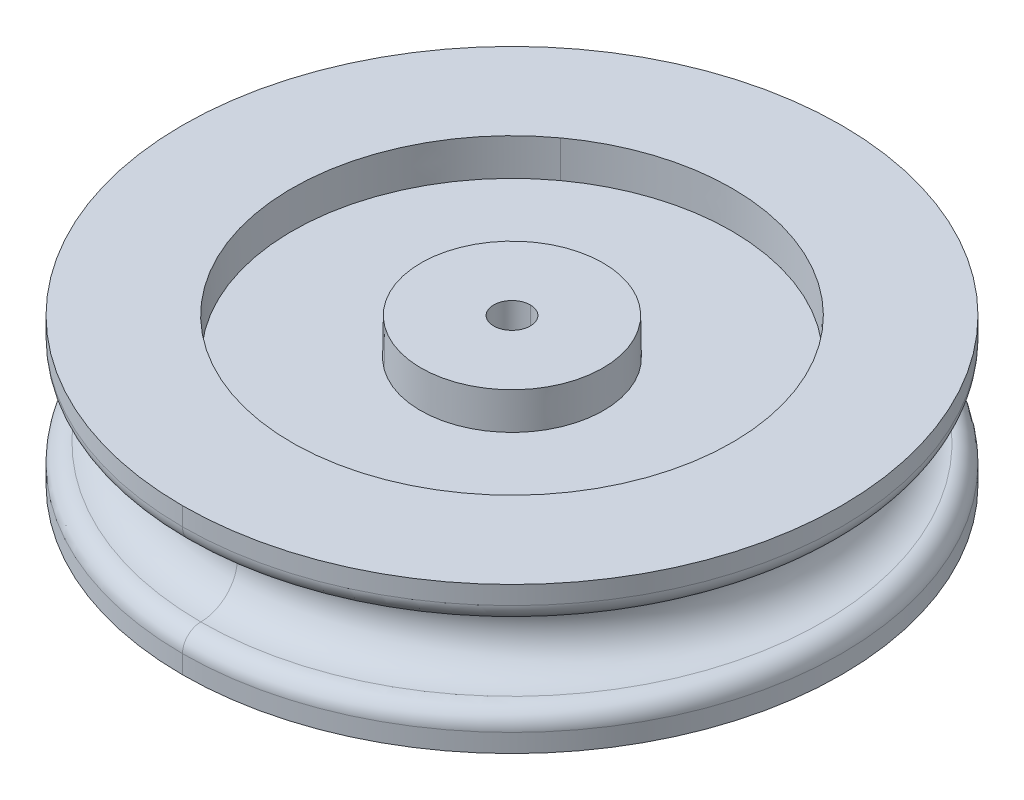
ISO-10303-21;
HEADER;
FILE_DESCRIPTION(('STEP AP214'),'2;1');
FILE_NAME('part.step','',(''),(''),'','','');
FILE_SCHEMA(('AUTOMOTIVE_DESIGN { 1 0 10303 214 1 1 1 1 }'));
ENDSEC;
DATA;
#1=APPLICATION_CONTEXT('core data for automotive mechanical design processes');
#2=APPLICATION_PROTOCOL_DEFINITION('international standard','automotive_design',2000,#1);
#3=PRODUCT_CONTEXT('',#1,'mechanical');
#4=PRODUCT('Part','Part','',(#3));
#5=PRODUCT_RELATED_PRODUCT_CATEGORY('part','',(#4));
#6=PRODUCT_DEFINITION_FORMATION('','',#4);
#7=PRODUCT_DEFINITION_CONTEXT('part definition',#1,'design');
#8=PRODUCT_DEFINITION('design','',#6,#7);
#9=PRODUCT_DEFINITION_SHAPE('','',#8);
#10=(LENGTH_UNIT() NAMED_UNIT(*) SI_UNIT(.MILLI.,.METRE.));
#11=(NAMED_UNIT(*) PLANE_ANGLE_UNIT() SI_UNIT($,.RADIAN.));
#12=(NAMED_UNIT(*) SI_UNIT($,.STERADIAN.) SOLID_ANGLE_UNIT());
#13=UNCERTAINTY_MEASURE_WITH_UNIT(LENGTH_MEASURE(1.E-05),#10,'distance_accuracy_value','');
#14=(GEOMETRIC_REPRESENTATION_CONTEXT(3) GLOBAL_UNCERTAINTY_ASSIGNED_CONTEXT((#13)) GLOBAL_UNIT_ASSIGNED_CONTEXT((#10,
#11,#12)) REPRESENTATION_CONTEXT('',''));
#15=CARTESIAN_POINT('',(0.,0.,0.));
#16=DIRECTION('',(0.,0.,1.));
#17=DIRECTION('',(1.,0.,0.));
#18=AXIS2_PLACEMENT_3D('',#15,#16,#17);
#19=CARTESIAN_POINT('',(0.,3.5,0.));
#20=DIRECTION('',(0.,-1.,0.));
#21=DIRECTION('',(0.,0.,-1.));
#22=AXIS2_PLACEMENT_3D('',#19,#20,#21);
#23=TOROIDAL_SURFACE('',#22,8.50000000000016,0.49999999999996);
#24=CARTESIAN_POINT('',(0.,3.5,-8.50000000000008));
#25=DIRECTION('',(1.,0.,0.));
#26=DIRECTION('',(0.,-1.,1.56125112837913E-13));
#27=AXIS2_PLACEMENT_3D('',#24,#25,#26);
#28=CIRCLE('',#27,0.49999999999996);
#29=CARTESIAN_POINT('',(0.,3.,-8.5));
#30=VERTEX_POINT('',#29);
#31=CARTESIAN_POINT('',(0.,3.5,-9.));
#32=VERTEX_POINT('',#31);
#33=EDGE_CURVE('E339',#30,#32,#28,.T.);
#34=ORIENTED_EDGE('',*,*,#33,.F.);
#35=CARTESIAN_POINT('',(0.,3.,0.));
#36=DIRECTION('',(0.,1.,0.));
#37=DIRECTION('',(0.,0.,-1.));
#38=AXIS2_PLACEMENT_3D('',#35,#36,#37);
#39=CIRCLE('',#38,8.5);
#40=CARTESIAN_POINT('',(0.,3.,8.5));
#41=VERTEX_POINT('',#40);
#42=EDGE_CURVE('E27',#30,#41,#39,.T.);
#43=ORIENTED_EDGE('',*,*,#42,.T.);
#44=CARTESIAN_POINT('',(0.,3.5,8.50000000000008));
#45=DIRECTION('',(-1.,0.,0.));
#46=DIRECTION('',(0.,-1.,-1.56125112837913E-13));
#47=AXIS2_PLACEMENT_3D('',#44,#45,#46);
#48=CIRCLE('',#47,0.49999999999996);
#49=CARTESIAN_POINT('',(0.,3.5,9.));
#50=VERTEX_POINT('',#49);
#51=EDGE_CURVE('E332',#41,#50,#48,.T.);
#52=ORIENTED_EDGE('',*,*,#51,.T.);
#53=CARTESIAN_POINT('',(0.,3.5,0.));
#54=DIRECTION('',(0.,1.,0.));
#55=DIRECTION('',(0.,0.,-1.));
#56=AXIS2_PLACEMENT_3D('',#53,#54,#55);
#57=CIRCLE('',#56,9.);
#58=EDGE_CURVE('E366',#32,#50,#57,.T.);
#59=ORIENTED_EDGE('',*,*,#58,.F.);
#60=EDGE_LOOP('',(#34,#43,#52,#59));
#61=FACE_BOUND('',#60,.T.);
#62=ADVANCED_FACE('F16',(#61),#23,.T.);
#63=CARTESIAN_POINT('',(0.,0.50000000000001,0.));
#64=DIRECTION('',(0.,1.,0.));
#65=DIRECTION('',(0.,0.,1.));
#66=AXIS2_PLACEMENT_3D('',#63,#64,#65);
#67=TOROIDAL_SURFACE('',#66,8.50000000000015,0.49999999999996);
#68=CARTESIAN_POINT('',(0.,0.500000000000007,8.50000000000008));
#69=DIRECTION('',(1.,0.,0.));
#70=DIRECTION('',(0.,1.,-1.59594559789868E-13));
#71=AXIS2_PLACEMENT_3D('',#68,#69,#70);
#72=CIRCLE('',#71,0.499999999999956);
#73=CARTESIAN_POINT('',(0.,1.,8.5));
#74=VERTEX_POINT('',#73);
#75=CARTESIAN_POINT('',(0.,0.5,9.));
#76=VERTEX_POINT('',#75);
#77=EDGE_CURVE('E324',#74,#76,#72,.T.);
#78=ORIENTED_EDGE('',*,*,#77,.F.);
#79=CARTESIAN_POINT('',(0.,1.,0.));
#80=DIRECTION('',(0.,-1.,0.));
#81=DIRECTION('',(0.,0.,1.));
#82=AXIS2_PLACEMENT_3D('',#79,#80,#81);
#83=CIRCLE('',#82,8.5);
#84=CARTESIAN_POINT('',(0.,1.,-8.5));
#85=VERTEX_POINT('',#84);
#86=EDGE_CURVE('E11',#74,#85,#83,.T.);
#87=ORIENTED_EDGE('',*,*,#86,.T.);
#88=CARTESIAN_POINT('',(0.,0.500000000000007,-8.50000000000007));
#89=DIRECTION('',(-1.,0.,0.));
#90=DIRECTION('',(0.,1.,1.422473250301E-13));
#91=AXIS2_PLACEMENT_3D('',#88,#89,#90);
#92=CIRCLE('',#91,0.49999999999996);
#93=CARTESIAN_POINT('',(0.,0.5,-9.));
#94=VERTEX_POINT('',#93);
#95=EDGE_CURVE('E316',#85,#94,#92,.T.);
#96=ORIENTED_EDGE('',*,*,#95,.T.);
#97=CARTESIAN_POINT('',(0.,0.499999999999999,0.));
#98=DIRECTION('',(0.,-1.,0.));
#99=DIRECTION('',(0.,0.,1.));
#100=AXIS2_PLACEMENT_3D('',#97,#98,#99);
#101=CIRCLE('',#100,9.);
#102=EDGE_CURVE('E372',#76,#94,#101,.T.);
#103=ORIENTED_EDGE('',*,*,#102,.F.);
#104=EDGE_LOOP('',(#78,#87,#96,#103));
#105=FACE_BOUND('',#104,.T.);
#106=ADVANCED_FACE('F531',(#105),#67,.T.);
#107=CARTESIAN_POINT('',(0.,2.,0.));
#108=DIRECTION('',(0.,1.,0.));
#109=DIRECTION('',(-1.,0.,0.));
#110=AXIS2_PLACEMENT_3D('',#107,#108,#109);
#111=TOROIDAL_SURFACE('',#110,8.49999999999998,0.999999999999987);
#112=CARTESIAN_POINT('',(0.,2.,8.49999999999999));
#113=DIRECTION('',(-1.,0.,0.));
#114=DIRECTION('',(0.,1.,0.));
#115=AXIS2_PLACEMENT_3D('',#112,#113,#114);
#116=CIRCLE('',#115,0.999999999999995);
#117=EDGE_CURVE('E312',#41,#74,#116,.T.);
#118=ORIENTED_EDGE('',*,*,#117,.F.);
#119=ORIENTED_EDGE('',*,*,#42,.F.);
#120=CARTESIAN_POINT('',(0.,2.,-8.49999999999998));
#121=DIRECTION('',(1.,0.,0.));
#122=DIRECTION('',(0.,1.,0.));
#123=AXIS2_PLACEMENT_3D('',#120,#121,#122);
#124=CIRCLE('',#123,0.999999999999987);
#125=EDGE_CURVE('E308',#30,#85,#124,.T.);
#126=ORIENTED_EDGE('',*,*,#125,.T.);
#127=ORIENTED_EDGE('',*,*,#86,.F.);
#128=EDGE_LOOP('',(#118,#119,#126,#127));
#129=FACE_BOUND('',#128,.T.);
#130=ADVANCED_FACE('F547',(#129),#111,.F.);
#131=CARTESIAN_POINT('',(0.,-1.49999999999998,0.));
#132=DIRECTION('',(0.,-1.,0.));
#133=DIRECTION('',(0.,0.,-1.));
#134=AXIS2_PLACEMENT_3D('',#131,#132,#133);
#135=CONICAL_SURFACE('',#134,1.29999999999997,0.785398163397497);
#136=DIRECTION('',(-0.415626937777471,0.707106781186524,0.5720614028177));
#137=VECTOR('',#136,1.);
#138=CARTESIAN_POINT('',(0.675953040136335,-1.35000000000002,-0.930369543531175));
#139=LINE('',#138,#137);
#140=CARTESIAN_POINT('',(0.764120827980202,-1.5,-1.05172209268741));
#141=VERTEX_POINT('',#140);
#142=CARTESIAN_POINT('',(0.587785252292468,-1.20000000000004,-0.80901699437494));
#143=VERTEX_POINT('',#142);
#144=EDGE_CURVE('E300',#141,#143,#139,.T.);
#145=ORIENTED_EDGE('',*,*,#144,.F.);
#146=CARTESIAN_POINT('',(0.,-1.5,0.));
#147=DIRECTION('',(0.,1.,0.));
#148=DIRECTION('',(-0.587785252292495,0.,0.809016994374932));
#149=AXIS2_PLACEMENT_3D('',#146,#147,#148);
#150=CIRCLE('',#149,1.29999999999997);
#151=CARTESIAN_POINT('',(-0.764120827980206,-1.5,1.05172209268741));
#152=VERTEX_POINT('',#151);
#153=EDGE_CURVE('E239',#152,#141,#150,.T.);
#154=ORIENTED_EDGE('',*,*,#153,.F.);
#155=DIRECTION('',(0.415626937777472,0.707106781186524,-0.5720614028177));
#156=VECTOR('',#155,1.);
#157=CARTESIAN_POINT('',(-0.675953040136334,-1.35000000000001,0.930369543531168));
#158=LINE('',#157,#156);
#159=CARTESIAN_POINT('',(-0.587785252292462,-1.20000000000002,0.809016994374927));
#160=VERTEX_POINT('',#159);
#161=EDGE_CURVE('E288',#152,#160,#158,.T.);
#162=ORIENTED_EDGE('',*,*,#161,.T.);
#163=CARTESIAN_POINT('',(0.,-1.2000000000001,1.21268012992504E-13));
#164=DIRECTION('',(0.,-1.,1.02402053411253E-13));
#165=DIRECTION('',(0.,1.02348685082644E-13,1.));
#166=AXIS2_PLACEMENT_3D('',#163,#164,#165);
#167=CIRCLE('',#166,0.999999999999879);
#168=CARTESIAN_POINT('',(0.,-1.2,1.));
#169=VERTEX_POINT('',#168);
#170=EDGE_CURVE('E637',#169,#160,#167,.T.);
#171=ORIENTED_EDGE('',*,*,#170,.F.);
#172=CARTESIAN_POINT('',(0.,-1.20000000000008,0.));
#173=DIRECTION('',(0.,-1.,0.));
#174=DIRECTION('',(0.587785252292458,0.,-0.809016994374958));
#175=AXIS2_PLACEMENT_3D('',#172,#173,#174);
#176=CIRCLE('',#175,0.999999999999978);
#177=EDGE_CURVE('E471',#143,#169,#176,.T.);
#178=ORIENTED_EDGE('',*,*,#177,.F.);
#179=EDGE_LOOP('',(#145,#154,#162,#171,#178));
#180=FACE_BOUND('',#179,.T.);
#181=ADVANCED_FACE('F552',(#180),#135,.F.);
#182=CARTESIAN_POINT('',(0.,2.7,0.));
#183=DIRECTION('',(0.,1.,0.));
#184=DIRECTION('',(-1.,0.,0.));
#185=AXIS2_PLACEMENT_3D('',#182,#183,#184);
#186=CYLINDRICAL_SURFACE('',#185,0.5);
#187=DIRECTION('',(0.,1.,0.));
#188=VECTOR('',#187,1.);
#189=CARTESIAN_POINT('',(0.,3.35,0.5));
#190=LINE('',#189,#188);
#191=CARTESIAN_POINT('',(0.,2.7,0.5));
#192=VERTEX_POINT('',#191);
#193=CARTESIAN_POINT('',(0.,4.,0.5));
#194=VERTEX_POINT('',#193);
#195=EDGE_CURVE('E277',#192,#194,#190,.T.);
#196=ORIENTED_EDGE('',*,*,#195,.F.);
#197=CARTESIAN_POINT('',(0.,2.7,0.));
#198=DIRECTION('',(0.,1.,0.));
#199=DIRECTION('',(0.,0.,-1.));
#200=AXIS2_PLACEMENT_3D('',#197,#198,#199);
#201=CIRCLE('',#200,0.5);
#202=CARTESIAN_POINT('',(0.,2.7,-0.5));
#203=VERTEX_POINT('',#202);
#204=EDGE_CURVE('E461',#203,#192,#201,.T.);
#205=ORIENTED_EDGE('',*,*,#204,.F.);
#206=DIRECTION('',(0.,1.,0.));
#207=VECTOR('',#206,1.);
#208=CARTESIAN_POINT('',(0.,3.35,-0.5));
#209=LINE('',#208,#207);
#210=CARTESIAN_POINT('',(0.,4.,-0.5));
#211=VERTEX_POINT('',#210);
#212=EDGE_CURVE('E269',#203,#211,#209,.T.);
#213=ORIENTED_EDGE('',*,*,#212,.T.);
#214=CARTESIAN_POINT('',(0.,4.,0.));
#215=DIRECTION('',(0.,1.,0.));
#216=DIRECTION('',(0.,0.,-1.));
#217=AXIS2_PLACEMENT_3D('',#214,#215,#216);
#218=CIRCLE('',#217,0.5);
#219=EDGE_CURVE('E238',#211,#194,#218,.T.);
#220=ORIENTED_EDGE('',*,*,#219,.T.);
#221=EDGE_LOOP('',(#196,#205,#213,#220));
#222=FACE_BOUND('',#221,.T.);
#223=ADVANCED_FACE('F555',(#222),#186,.F.);
#224=CARTESIAN_POINT('',(0.,4.,0.));
#225=DIRECTION('',(0.,-1.,0.));
#226=DIRECTION('',(0.,0.,-1.));
#227=AXIS2_PLACEMENT_3D('',#224,#225,#226);
#228=CONICAL_SURFACE('',#227,2.486036459,0.0139626335668598);
#229=DIRECTION('',(0.00820676342925118,-0.999902524015575,-0.0112956408096051));
#230=VECTOR('',#229,1.);
#231=CARTESIAN_POINT('',(1.46535934899639,3.5,-2.01689411495205));
#232=LINE('',#231,#230);
#233=CARTESIAN_POINT('',(1.4612555672616,4.,-2.01124574396672));
#234=VERTEX_POINT('',#233);
#235=CARTESIAN_POINT('',(1.46946313073118,3.,-2.02254248593737));
#236=VERTEX_POINT('',#235);
#237=EDGE_CURVE('E233',#234,#236,#232,.T.);
#238=ORIENTED_EDGE('',*,*,#237,.F.);
#239=CARTESIAN_POINT('',(0.,4.00000000000001,0.));
#240=DIRECTION('',(0.,-1.,0.));
#241=DIRECTION('',(0.587785252292472,0.,-0.809016994374948));
#242=AXIS2_PLACEMENT_3D('',#239,#240,#241);
#243=CIRCLE('',#242,2.486036459);
#244=CARTESIAN_POINT('',(-1.4612555672616,4.,2.01124574396672));
#245=VERTEX_POINT('',#244);
#246=EDGE_CURVE('E226',#234,#245,#243,.T.);
#247=ORIENTED_EDGE('',*,*,#246,.T.);
#248=DIRECTION('',(-0.00820676342925118,-0.999902524015575,0.0112956408096051));
#249=VECTOR('',#248,1.);
#250=CARTESIAN_POINT('',(-1.46535934899639,3.5,2.01689411495205));
#251=LINE('',#250,#249);
#252=CARTESIAN_POINT('',(-1.46946313073118,3.,2.02254248593737));
#253=VERTEX_POINT('',#252);
#254=EDGE_CURVE('E230',#245,#253,#251,.T.);
#255=ORIENTED_EDGE('',*,*,#254,.T.);
#256=CARTESIAN_POINT('',(0.,2.99999999999996,0.));
#257=DIRECTION('',(0.,-1.,0.));
#258=DIRECTION('',(0.587785252292476,0.,-0.809016994374946));
#259=AXIS2_PLACEMENT_3D('',#256,#257,#258);
#260=CIRCLE('',#259,2.50000000000002);
#261=EDGE_CURVE('E429',#236,#253,#260,.T.);
#262=ORIENTED_EDGE('',*,*,#261,.F.);
#263=EDGE_LOOP('',(#238,#247,#255,#262));
#264=FACE_BOUND('',#263,.T.);
#265=ADVANCED_FACE('F228',(#264),#228,.T.);
#266=CARTESIAN_POINT('',(0.,3.,0.));
#267=DIRECTION('',(0.,1.,0.));
#268=DIRECTION('',(-1.,0.,0.));
#269=AXIS2_PLACEMENT_3D('',#266,#267,#268);
#270=CONICAL_SURFACE('',#269,6.00000000000001,0.0139626335668593);
#271=DIRECTION('',(-0.00820676342925032,0.999902524015575,-0.0112956408096159));
#272=VECTOR('',#271,1.);
#273=CARTESIAN_POINT('',(-3.53081529548963,3.5,-4.85975033723501));
#274=LINE('',#273,#272);
#275=CARTESIAN_POINT('',(-3.52671151375484,3.,-4.85410196624968));
#276=VERTEX_POINT('',#275);
#277=CARTESIAN_POINT('',(-3.53491907722442,4.,-4.86539870822034));
#278=VERTEX_POINT('',#277);
#279=EDGE_CURVE('E407',#276,#278,#274,.T.);
#280=ORIENTED_EDGE('',*,*,#279,.F.);
#281=CARTESIAN_POINT('',(0.,3.00000000000001,0.));
#282=DIRECTION('',(0.,-1.,0.));
#283=DIRECTION('',(-0.587785252292475,0.,-0.809016994374946));
#284=AXIS2_PLACEMENT_3D('',#281,#282,#283);
#285=CIRCLE('',#284,6.00000000000001);
#286=CARTESIAN_POINT('',(0.,3.,-6.));
#287=VERTEX_POINT('',#286);
#288=EDGE_CURVE('E426',#276,#287,#285,.T.);
#289=ORIENTED_EDGE('',*,*,#288,.T.);
#290=CARTESIAN_POINT('',(0.,3.,0.));
#291=DIRECTION('',(0.,-1.,0.));
#292=DIRECTION('',(0.,0.,-1.));
#293=AXIS2_PLACEMENT_3D('',#290,#291,#292);
#294=CIRCLE('',#293,5.99999999999999);
#295=CARTESIAN_POINT('',(3.52671151375484,3.,4.85410196624969));
#296=VERTEX_POINT('',#295);
#297=EDGE_CURVE('E425',#287,#296,#294,.T.);
#298=ORIENTED_EDGE('',*,*,#297,.T.);
#299=DIRECTION('',(0.00820676342925032,0.999902524015575,0.0112956408096055));
#300=VECTOR('',#299,1.);
#301=CARTESIAN_POINT('',(3.53081529548963,3.5,4.85975033723502));
#302=LINE('',#301,#300);
#303=CARTESIAN_POINT('',(3.53491907722442,4.,4.86539870822034));
#304=VERTEX_POINT('',#303);
#305=EDGE_CURVE('E383',#296,#304,#302,.T.);
#306=ORIENTED_EDGE('',*,*,#305,.T.);
#307=CARTESIAN_POINT('',(0.,4.00000000000001,0.));
#308=DIRECTION('',(0.,-1.,0.));
#309=DIRECTION('',(0.,0.,-1.));
#310=AXIS2_PLACEMENT_3D('',#307,#308,#309);
#311=CIRCLE('',#310,6.01396354100001);
#312=CARTESIAN_POINT('',(0.,4.,-6.013963541));
#313=VERTEX_POINT('',#312);
#314=EDGE_CURVE('E434',#313,#304,#311,.T.);
#315=ORIENTED_EDGE('',*,*,#314,.F.);
#316=CARTESIAN_POINT('',(0.,4.00000000000001,0.));
#317=DIRECTION('',(0.,-1.,0.));
#318=DIRECTION('',(-0.58778525229247,0.,-0.80901699437495));
#319=AXIS2_PLACEMENT_3D('',#316,#317,#318);
#320=CIRCLE('',#319,6.01396354100008);
#321=EDGE_CURVE('E433',#278,#313,#320,.T.);
#322=ORIENTED_EDGE('',*,*,#321,.F.);
#323=EDGE_LOOP('',(#280,#289,#298,#306,#315,#322));
#324=FACE_BOUND('',#323,.T.);
#325=ADVANCED_FACE('F431',(#324),#270,.F.);
#326=CARTESIAN_POINT('',(0.,3.5,0.));
#327=DIRECTION('',(0.,1.,0.));
#328=DIRECTION('',(0.,0.,1.));
#329=AXIS2_PLACEMENT_3D('',#326,#327,#328);
#330=CYLINDRICAL_SURFACE('',#329,9.);
#331=DIRECTION('',(0.,1.,0.));
#332=VECTOR('',#331,1.);
#333=CARTESIAN_POINT('',(0.,3.75,-9.));
#334=LINE('',#333,#332);
#335=CARTESIAN_POINT('',(0.,4.,-9.));
#336=VERTEX_POINT('',#335);
#337=EDGE_CURVE('E375',#32,#336,#334,.T.);
#338=ORIENTED_EDGE('',*,*,#337,.F.);
#339=ORIENTED_EDGE('',*,*,#58,.T.);
#340=DIRECTION('',(0.,1.,0.));
#341=VECTOR('',#340,1.);
#342=CARTESIAN_POINT('',(0.,3.75,9.));
#343=LINE('',#342,#341);
#344=CARTESIAN_POINT('',(0.,4.,9.));
#345=VERTEX_POINT('',#344);
#346=EDGE_CURVE('E386',#50,#345,#343,.T.);
#347=ORIENTED_EDGE('',*,*,#346,.T.);
#348=CARTESIAN_POINT('',(0.,4.,0.));
#349=DIRECTION('',(0.,-1.,0.));
#350=DIRECTION('',(0.,0.,1.));
#351=AXIS2_PLACEMENT_3D('',#348,#349,#350);
#352=CIRCLE('',#351,9.);
#353=EDGE_CURVE('E377',#345,#336,#352,.T.);
#354=ORIENTED_EDGE('',*,*,#353,.T.);
#355=EDGE_LOOP('',(#338,#339,#347,#354));
#356=FACE_BOUND('',#355,.T.);
#357=ADVANCED_FACE('F376',(#356),#330,.T.);
#358=CARTESIAN_POINT('',(0.,0.,0.));
#359=DIRECTION('',(0.,1.,0.));
#360=DIRECTION('',(0.,0.,1.));
#361=AXIS2_PLACEMENT_3D('',#358,#359,#360);
#362=CYLINDRICAL_SURFACE('',#361,9.);
#363=DIRECTION('',(0.,1.,0.));
#364=VECTOR('',#363,1.);
#365=CARTESIAN_POINT('',(0.,0.25,-9.));
#366=LINE('',#365,#364);
#367=CARTESIAN_POINT('',(0.,0.,-9.));
#368=VERTEX_POINT('',#367);
#369=EDGE_CURVE('E395',#368,#94,#366,.T.);
#370=ORIENTED_EDGE('',*,*,#369,.F.);
#371=CARTESIAN_POINT('',(0.,0.,0.));
#372=DIRECTION('',(0.,-1.,0.));
#373=DIRECTION('',(0.,0.,1.));
#374=AXIS2_PLACEMENT_3D('',#371,#372,#373);
#375=CIRCLE('',#374,9.);
#376=CARTESIAN_POINT('',(0.,0.,9.));
#377=VERTEX_POINT('',#376);
#378=EDGE_CURVE('E437',#377,#368,#375,.T.);
#379=ORIENTED_EDGE('',*,*,#378,.F.);
#380=DIRECTION('',(0.,1.,0.));
#381=VECTOR('',#380,1.);
#382=CARTESIAN_POINT('',(0.,0.25,9.));
#383=LINE('',#382,#381);
#384=EDGE_CURVE('E518',#377,#76,#383,.T.);
#385=ORIENTED_EDGE('',*,*,#384,.T.);
#386=ORIENTED_EDGE('',*,*,#102,.T.);
#387=EDGE_LOOP('',(#370,#379,#385,#386));
#388=FACE_BOUND('',#387,.T.);
#389=ADVANCED_FACE('F566',(#388),#362,.T.);
#390=CARTESIAN_POINT('',(0.,0.,0.));
#391=DIRECTION('',(0.,-1.,0.));
#392=DIRECTION('',(1.,0.,0.));
#393=AXIS2_PLACEMENT_3D('',#390,#391,#392);
#394=CONICAL_SURFACE('',#393,6.01396354100001,0.0139626335668576);
#395=DIRECTION('',(-0.00820676342925031,0.999902524015575,0.0112956408096055));
#396=VECTOR('',#395,1.);
#397=CARTESIAN_POINT('',(3.53081529548963,0.5,-4.85975033723502));
#398=LINE('',#397,#396);
#399=CARTESIAN_POINT('',(3.53491907722442,0.,-4.86539870822034));
#400=VERTEX_POINT('',#399);
#401=CARTESIAN_POINT('',(3.52671151375484,1.,-4.85410196624969));
#402=VERTEX_POINT('',#401);
#403=EDGE_CURVE('E510',#400,#402,#398,.T.);
#404=ORIENTED_EDGE('',*,*,#403,.F.);
#405=CARTESIAN_POINT('',(0.,0.,0.));
#406=DIRECTION('',(0.,-1.,0.));
#407=DIRECTION('',(0.587785252292475,0.,-0.809016994374946));
#408=AXIS2_PLACEMENT_3D('',#405,#406,#407);
#409=CIRCLE('',#408,6.01396354100004);
#410=CARTESIAN_POINT('',(-3.53491907722442,0.,4.86539870822034));
#411=VERTEX_POINT('',#410);
#412=EDGE_CURVE('E654',#400,#411,#409,.T.);
#413=ORIENTED_EDGE('',*,*,#412,.T.);
#414=DIRECTION('',(0.00820676342925031,0.999902524015575,-0.0112956408096055));
#415=VECTOR('',#414,1.);
#416=CARTESIAN_POINT('',(-3.53081529548963,0.5,4.85975033723502));
#417=LINE('',#416,#415);
#418=CARTESIAN_POINT('',(-3.52671151375484,1.,4.85410196624969));
#419=VERTEX_POINT('',#418);
#420=EDGE_CURVE('E499',#411,#419,#417,.T.);
#421=ORIENTED_EDGE('',*,*,#420,.T.);
#422=CARTESIAN_POINT('',(0.,1.,0.));
#423=DIRECTION('',(0.,-1.,0.));
#424=DIRECTION('',(0.587785252292476,0.,-0.809016994374946));
#425=AXIS2_PLACEMENT_3D('',#422,#423,#424);
#426=CIRCLE('',#425,6.00000000000004);
#427=EDGE_CURVE('E651',#402,#419,#426,.T.);
#428=ORIENTED_EDGE('',*,*,#427,.F.);
#429=EDGE_LOOP('',(#404,#413,#421,#428));
#430=FACE_BOUND('',#429,.T.);
#431=ADVANCED_FACE('F569',(#430),#394,.F.);
#432=CARTESIAN_POINT('',(0.,1.,0.));
#433=DIRECTION('',(0.,1.,0.));
#434=DIRECTION('',(0.,0.,1.));
#435=AXIS2_PLACEMENT_3D('',#432,#433,#434);
#436=CONICAL_SURFACE('',#435,2.5,0.0139626341667452);
#437=DIRECTION('',(0.00820676378182003,-0.999902524007199,0.0112956412948775));
#438=VECTOR('',#437,1.);
#439=CARTESIAN_POINT('',(-1.45920367595336,-0.25,-2.00842155786729));
#440=LINE('',#439,#438);
#441=CARTESIAN_POINT('',(-1.46946313073118,1.,-2.02254248593737));
#442=VERTEX_POINT('',#441);
#443=CARTESIAN_POINT('',(-1.44894422117555,-1.5,-1.99430062979721));
#444=VERTEX_POINT('',#443);
#445=EDGE_CURVE('E488',#442,#444,#440,.T.);
#446=ORIENTED_EDGE('',*,*,#445,.F.);
#447=CARTESIAN_POINT('',(0.,1.,0.));
#448=DIRECTION('',(0.,-1.,0.));
#449=DIRECTION('',(-0.587785252292471,0.,-0.809016994374949));
#450=AXIS2_PLACEMENT_3D('',#447,#448,#449);
#451=CIRCLE('',#450,2.50000000000001);
#452=CARTESIAN_POINT('',(0.,1.,-2.5));
#453=VERTEX_POINT('',#452);
#454=EDGE_CURVE('E42',#442,#453,#451,.T.);
#455=ORIENTED_EDGE('',*,*,#454,.T.);
#456=CARTESIAN_POINT('',(0.,1.,0.));
#457=DIRECTION('',(0.,-1.,0.));
#458=DIRECTION('',(0.,0.,-1.));
#459=AXIS2_PLACEMENT_3D('',#456,#457,#458);
#460=CIRCLE('',#459,2.5);
#461=CARTESIAN_POINT('',(1.46946313073118,1.,2.02254248593737));
#462=VERTEX_POINT('',#461);
#463=EDGE_CURVE('E647',#453,#462,#460,.T.);
#464=ORIENTED_EDGE('',*,*,#463,.T.);
#465=DIRECTION('',(-0.00820676378182003,-0.999902524007199,-0.0112956412948775));
#466=VECTOR('',#465,1.);
#467=CARTESIAN_POINT('',(1.45920367595336,-0.25,2.00842155786729));
#468=LINE('',#467,#466);
#469=CARTESIAN_POINT('',(1.44894422117555,-1.5,1.99430062979721));
#470=VERTEX_POINT('',#469);
#471=EDGE_CURVE('E481',#462,#470,#468,.T.);
#472=ORIENTED_EDGE('',*,*,#471,.T.);
#473=CARTESIAN_POINT('',(0.,-1.5,0.));
#474=DIRECTION('',(0.,-1.,0.));
#475=DIRECTION('',(0.,0.,-1.));
#476=AXIS2_PLACEMENT_3D('',#473,#474,#475);
#477=CIRCLE('',#476,2.465091146);
#478=CARTESIAN_POINT('',(0.,-1.5,-2.465091146));
#479=VERTEX_POINT('',#478);
#480=EDGE_CURVE('E459',#479,#470,#477,.T.);
#481=ORIENTED_EDGE('',*,*,#480,.F.);
#482=CARTESIAN_POINT('',(0.,-1.50000000000001,0.));
#483=DIRECTION('',(0.,-1.,0.));
#484=DIRECTION('',(-0.587785252292481,0.,-0.809016994374941));
#485=AXIS2_PLACEMENT_3D('',#482,#483,#484);
#486=CIRCLE('',#485,2.46509114599995);
#487=EDGE_CURVE('E455',#444,#479,#486,.T.);
#488=ORIENTED_EDGE('',*,*,#487,.F.);
#489=EDGE_LOOP('',(#446,#455,#464,#472,#481,#488));
#490=FACE_BOUND('',#489,.T.);
#491=ADVANCED_FACE('F572',(#490),#436,.T.);
#492=CARTESIAN_POINT('',(0.,2.7,0.));
#493=DIRECTION('',(0.,-1.,0.));
#494=DIRECTION('',(1.,0.,0.));
#495=AXIS2_PLACEMENT_3D('',#492,#493,#494);
#496=CYLINDRICAL_SURFACE('',#495,1.);
#497=DIRECTION('',(0.,-1.,0.));
#498=VECTOR('',#497,1.);
#499=CARTESIAN_POINT('',(0.,0.75,-1.));
#500=LINE('',#499,#498);
#501=CARTESIAN_POINT('',(0.,2.7,-1.));
#502=VERTEX_POINT('',#501);
#503=CARTESIAN_POINT('',(0.,-1.2,-1.));
#504=VERTEX_POINT('',#503);
#505=EDGE_CURVE('E475',#502,#504,#500,.T.);
#506=ORIENTED_EDGE('',*,*,#505,.F.);
#507=CARTESIAN_POINT('',(0.,2.7,0.));
#508=DIRECTION('',(0.,1.,0.));
#509=DIRECTION('',(0.,0.,-1.));
#510=AXIS2_PLACEMENT_3D('',#507,#508,#509);
#511=CIRCLE('',#510,1.);
#512=CARTESIAN_POINT('',(0.,2.7,1.));
#513=VERTEX_POINT('',#512);
#514=EDGE_CURVE('E464',#502,#513,#511,.T.);
#515=ORIENTED_EDGE('',*,*,#514,.T.);
#516=DIRECTION('',(0.,-1.,0.));
#517=VECTOR('',#516,1.);
#518=CARTESIAN_POINT('',(0.,0.75,1.));
#519=LINE('',#518,#517);
#520=EDGE_CURVE('E467',#513,#169,#519,.T.);
#521=ORIENTED_EDGE('',*,*,#520,.T.);
#522=ORIENTED_EDGE('',*,*,#170,.T.);
#523=CARTESIAN_POINT('',(0.,-1.20000000000003,0.));
#524=DIRECTION('',(0.,-1.,0.));
#525=DIRECTION('',(-0.587785252292447,0.,0.809016994374966));
#526=AXIS2_PLACEMENT_3D('',#523,#524,#525);
#527=CIRCLE('',#526,0.999999999999961);
#528=EDGE_CURVE('E292',#160,#504,#527,.T.);
#529=ORIENTED_EDGE('',*,*,#528,.T.);
#530=EDGE_LOOP('',(#506,#515,#521,#522,#529));
#531=FACE_BOUND('',#530,.T.);
#532=ADVANCED_FACE('F576',(#531),#496,.F.);
#533=CARTESIAN_POINT('',(-7.06342302750968,1.,7.42640786499874));
#534=DIRECTION('',(0.,-1.,0.));
#535=DIRECTION('',(0.,0.,-1.));
#536=AXIS2_PLACEMENT_3D('',#533,#534,#535);
#537=PLANE('',#536);
#538=ORIENTED_EDGE('',*,*,#463,.F.);
#539=ORIENTED_EDGE('',*,*,#454,.F.);
#540=CARTESIAN_POINT('',(0.,1.,0.));
#541=DIRECTION('',(0.,-1.,0.));
#542=DIRECTION('',(0.587785252292474,0.,0.809016994374947));
#543=AXIS2_PLACEMENT_3D('',#540,#541,#542);
#544=CIRCLE('',#543,2.49999999999999);
#545=EDGE_CURVE('E492',#462,#442,#544,.T.);
#546=ORIENTED_EDGE('',*,*,#545,.F.);
#547=EDGE_LOOP('',(#538,#539,#546));
#548=FACE_BOUND('',#547,.T.);
#549=CARTESIAN_POINT('',(0.,1.,0.));
#550=DIRECTION('',(0.,-1.,0.));
#551=DIRECTION('',(0.,0.,-1.));
#552=AXIS2_PLACEMENT_3D('',#549,#550,#551);
#553=CIRCLE('',#552,6.00000000000006);
#554=CARTESIAN_POINT('',(0.,1.,-6.));
#555=VERTEX_POINT('',#554);
#556=EDGE_CURVE('E506',#555,#402,#553,.T.);
#557=ORIENTED_EDGE('',*,*,#556,.T.);
#558=ORIENTED_EDGE('',*,*,#427,.T.);
#559=CARTESIAN_POINT('',(0.,1.,0.));
#560=DIRECTION('',(0.,-1.,0.));
#561=DIRECTION('',(-0.587785252292474,0.,0.809016994374947));
#562=AXIS2_PLACEMENT_3D('',#559,#560,#561);
#563=CIRCLE('',#562,6.);
#564=EDGE_CURVE('E503',#419,#555,#563,.T.);
#565=ORIENTED_EDGE('',*,*,#564,.T.);
#566=EDGE_LOOP('',(#557,#558,#565));
#567=FACE_BOUND('',#566,.T.);
#568=ADVANCED_FACE('F579',(#548,#567),#537,.T.);
#569=CARTESIAN_POINT('',(-9.01,0.,9.01));
#570=DIRECTION('',(0.,-1.,0.));
#571=DIRECTION('',(0.,0.,-1.));
#572=AXIS2_PLACEMENT_3D('',#569,#570,#571);
#573=PLANE('',#572);
#574=CARTESIAN_POINT('',(0.,0.,0.));
#575=DIRECTION('',(0.,-1.,0.));
#576=DIRECTION('',(0.,0.,-1.));
#577=AXIS2_PLACEMENT_3D('',#574,#575,#576);
#578=CIRCLE('',#577,6.01396354100005);
#579=CARTESIAN_POINT('',(0.,0.,-6.013963541));
#580=VERTEX_POINT('',#579);
#581=EDGE_CURVE('E514',#580,#400,#578,.T.);
#582=ORIENTED_EDGE('',*,*,#581,.F.);
#583=CARTESIAN_POINT('',(0.,0.,0.));
#584=DIRECTION('',(0.,-1.,0.));
#585=DIRECTION('',(-0.587785252292474,0.,0.809016994374947));
#586=AXIS2_PLACEMENT_3D('',#583,#584,#585);
#587=CIRCLE('',#586,6.01396354100002);
#588=EDGE_CURVE('E496',#411,#580,#587,.T.);
#589=ORIENTED_EDGE('',*,*,#588,.F.);
#590=ORIENTED_EDGE('',*,*,#412,.F.);
#591=EDGE_LOOP('',(#582,#589,#590));
#592=FACE_BOUND('',#591,.T.);
#593=CARTESIAN_POINT('',(0.,0.,0.));
#594=DIRECTION('',(0.,-1.,0.));
#595=DIRECTION('',(0.,0.,-1.));
#596=AXIS2_PLACEMENT_3D('',#593,#594,#595);
#597=CIRCLE('',#596,9.);
#598=EDGE_CURVE('E388',#368,#377,#597,.T.);
#599=ORIENTED_EDGE('',*,*,#598,.T.);
#600=ORIENTED_EDGE('',*,*,#378,.T.);
#601=EDGE_LOOP('',(#599,#600));
#602=FACE_BOUND('',#601,.T.);
#603=ADVANCED_FACE('F583',(#592,#602),#573,.T.);
#604=CARTESIAN_POINT('',(-9.01,4.,-9.01));
#605=DIRECTION('',(0.,1.,0.));
#606=DIRECTION('',(0.,0.,1.));
#607=AXIS2_PLACEMENT_3D('',#604,#605,#606);
#608=PLANE('',#607);
#609=ORIENTED_EDGE('',*,*,#314,.T.);
#610=CARTESIAN_POINT('',(0.,4.,0.));
#611=DIRECTION('',(0.,-1.,0.));
#612=DIRECTION('',(0.587785252292471,0.,0.809016994374949));
#613=AXIS2_PLACEMENT_3D('',#610,#611,#612);
#614=CIRCLE('',#613,6.01396354100002);
#615=EDGE_CURVE('E403',#304,#278,#614,.T.);
#616=ORIENTED_EDGE('',*,*,#615,.T.);
#617=ORIENTED_EDGE('',*,*,#321,.T.);
#618=EDGE_LOOP('',(#609,#616,#617));
#619=FACE_BOUND('',#618,.T.);
#620=CARTESIAN_POINT('',(0.,4.,0.));
#621=DIRECTION('',(0.,-1.,0.));
#622=DIRECTION('',(0.,0.,-1.));
#623=AXIS2_PLACEMENT_3D('',#620,#621,#622);
#624=CIRCLE('',#623,9.);
#625=EDGE_CURVE('E382',#336,#345,#624,.T.);
#626=ORIENTED_EDGE('',*,*,#625,.F.);
#627=ORIENTED_EDGE('',*,*,#353,.F.);
#628=EDGE_LOOP('',(#626,#627));
#629=FACE_BOUND('',#628,.T.);
#630=ADVANCED_FACE('F439',(#619,#629),#608,.T.);
#631=CARTESIAN_POINT('',(-7.06342302750968,3.,-6.01));
#632=DIRECTION('',(0.,1.,0.));
#633=DIRECTION('',(0.,0.,1.));
#634=AXIS2_PLACEMENT_3D('',#631,#632,#633);
#635=PLANE('',#634);
#636=CARTESIAN_POINT('',(0.,2.99999999999996,0.));
#637=DIRECTION('',(0.,-1.,0.));
#638=DIRECTION('',(0.,0.,-1.));
#639=AXIS2_PLACEMENT_3D('',#636,#637,#638);
#640=CIRCLE('',#639,2.5);
#641=CARTESIAN_POINT('',(0.,3.,-2.5));
#642=VERTEX_POINT('',#641);
#643=EDGE_CURVE('E258',#642,#236,#640,.T.);
#644=ORIENTED_EDGE('',*,*,#643,.T.);
#645=ORIENTED_EDGE('',*,*,#261,.T.);
#646=CARTESIAN_POINT('',(0.,3.,0.));
#647=DIRECTION('',(0.,-1.,0.));
#648=DIRECTION('',(-0.587785252292471,0.,0.809016994374949));
#649=AXIS2_PLACEMENT_3D('',#646,#647,#648);
#650=CIRCLE('',#649,2.49999999999999);
#651=EDGE_CURVE('E250',#253,#642,#650,.T.);
#652=ORIENTED_EDGE('',*,*,#651,.T.);
#653=EDGE_LOOP('',(#644,#645,#652));
#654=FACE_BOUND('',#653,.T.);
#655=ORIENTED_EDGE('',*,*,#297,.F.);
#656=ORIENTED_EDGE('',*,*,#288,.F.);
#657=CARTESIAN_POINT('',(0.,3.,0.));
#658=DIRECTION('',(0.,-1.,0.));
#659=DIRECTION('',(0.587785252292472,0.,0.809016994374949));
#660=AXIS2_PLACEMENT_3D('',#657,#658,#659);
#661=CIRCLE('',#660,6.00000000000002);
#662=EDGE_CURVE('E246',#296,#276,#661,.T.);
#663=ORIENTED_EDGE('',*,*,#662,.F.);
#664=EDGE_LOOP('',(#655,#656,#663));
#665=FACE_BOUND('',#664,.T.);
#666=ADVANCED_FACE('F424',(#654,#665),#635,.T.);
#667=CARTESIAN_POINT('',(-2.9325111345232,4.,-2.496036459));
#668=DIRECTION('',(0.,1.,0.));
#669=DIRECTION('',(0.,0.,1.));
#670=AXIS2_PLACEMENT_3D('',#667,#668,#669);
#671=PLANE('',#670);
#672=CARTESIAN_POINT('',(0.,4.,0.));
#673=DIRECTION('',(0.,1.,0.));
#674=DIRECTION('',(0.,0.,1.));
#675=AXIS2_PLACEMENT_3D('',#672,#673,#674);
#676=CIRCLE('',#675,0.5);
#677=EDGE_CURVE('E273',#194,#211,#676,.T.);
#678=ORIENTED_EDGE('',*,*,#677,.F.);
#679=ORIENTED_EDGE('',*,*,#219,.F.);
#680=EDGE_LOOP('',(#678,#679));
#681=FACE_BOUND('',#680,.T.);
#682=CARTESIAN_POINT('',(0.,4.00000000000001,0.));
#683=DIRECTION('',(0.,-1.,0.));
#684=DIRECTION('',(0.,0.,-1.));
#685=AXIS2_PLACEMENT_3D('',#682,#683,#684);
#686=CIRCLE('',#685,2.486036459);
#687=CARTESIAN_POINT('',(0.,4.,-2.486036459));
#688=VERTEX_POINT('',#687);
#689=EDGE_CURVE('E243',#688,#234,#686,.T.);
#690=ORIENTED_EDGE('',*,*,#689,.F.);
#691=CARTESIAN_POINT('',(0.,4.00000000000001,0.));
#692=DIRECTION('',(0.,-1.,0.));
#693=DIRECTION('',(-0.587785252292474,0.,0.809016994374947));
#694=AXIS2_PLACEMENT_3D('',#691,#692,#693);
#695=CIRCLE('',#694,2.48603645900001);
#696=EDGE_CURVE('E241',#245,#688,#695,.T.);
#697=ORIENTED_EDGE('',*,*,#696,.F.);
#698=ORIENTED_EDGE('',*,*,#246,.F.);
#699=EDGE_LOOP('',(#690,#697,#698));
#700=FACE_BOUND('',#699,.T.);
#701=ADVANCED_FACE('F242',(#681,#700),#671,.T.);
#702=CARTESIAN_POINT('',(-2.9078884423511,-1.5,3.05702022718886));
#703=DIRECTION('',(0.,-1.,0.));
#704=DIRECTION('',(0.,0.,-1.));
#705=AXIS2_PLACEMENT_3D('',#702,#703,#704);
#706=PLANE('',#705);
#707=CARTESIAN_POINT('',(0.,-1.5,0.));
#708=DIRECTION('',(0.,1.,0.));
#709=DIRECTION('',(0.,0.,-1.));
#710=AXIS2_PLACEMENT_3D('',#707,#708,#709);
#711=CIRCLE('',#710,1.3);
#712=CARTESIAN_POINT('',(0.,-1.5,-1.3));
#713=VERTEX_POINT('',#712);
#714=EDGE_CURVE('E284',#713,#152,#711,.T.);
#715=ORIENTED_EDGE('',*,*,#714,.T.);
#716=ORIENTED_EDGE('',*,*,#153,.T.);
#717=CARTESIAN_POINT('',(0.,-1.50000000000001,-1.30754782001752E-13));
#718=DIRECTION('',(0.,1.,0.));
#719=DIRECTION('',(0.587785252292523,0.,-0.809016994374911));
#720=AXIS2_PLACEMENT_3D('',#717,#718,#719);
#721=CIRCLE('',#720,1.29999999999987);
#722=EDGE_CURVE('E304',#141,#713,#721,.T.);
#723=ORIENTED_EDGE('',*,*,#722,.T.);
#724=EDGE_LOOP('',(#715,#716,#723));
#725=FACE_BOUND('',#724,.T.);
#726=ORIENTED_EDGE('',*,*,#480,.T.);
#727=CARTESIAN_POINT('',(0.,-1.5,0.));
#728=DIRECTION('',(0.,-1.,0.));
#729=DIRECTION('',(0.587785252292476,0.,0.809016994374946));
#730=AXIS2_PLACEMENT_3D('',#727,#728,#729);
#731=CIRCLE('',#730,2.46509114599999);
#732=EDGE_CURVE('E485',#470,#444,#731,.T.);
#733=ORIENTED_EDGE('',*,*,#732,.T.);
#734=ORIENTED_EDGE('',*,*,#487,.T.);
#735=EDGE_LOOP('',(#726,#733,#734));
#736=FACE_BOUND('',#735,.T.);
#737=ADVANCED_FACE('F595',(#725,#736),#706,.T.);
#738=CARTESIAN_POINT('',(-1.01,2.7,1.01));
#739=DIRECTION('',(0.,-1.,0.));
#740=DIRECTION('',(0.,0.,-1.));
#741=AXIS2_PLACEMENT_3D('',#738,#739,#740);
#742=PLANE('',#741);
#743=CARTESIAN_POINT('',(0.,2.7,0.));
#744=DIRECTION('',(0.,1.,0.));
#745=DIRECTION('',(0.,0.,1.));
#746=AXIS2_PLACEMENT_3D('',#743,#744,#745);
#747=CIRCLE('',#746,0.5);
#748=EDGE_CURVE('E280',#192,#203,#747,.T.);
#749=ORIENTED_EDGE('',*,*,#748,.T.);
#750=ORIENTED_EDGE('',*,*,#204,.T.);
#751=EDGE_LOOP('',(#749,#750));
#752=FACE_BOUND('',#751,.T.);
#753=ORIENTED_EDGE('',*,*,#514,.F.);
#754=CARTESIAN_POINT('',(0.,2.7,0.));
#755=DIRECTION('',(0.,1.,0.));
#756=DIRECTION('',(0.,0.,1.));
#757=AXIS2_PLACEMENT_3D('',#754,#755,#756);
#758=CIRCLE('',#757,1.);
#759=EDGE_CURVE('E478',#513,#502,#758,.T.);
#760=ORIENTED_EDGE('',*,*,#759,.F.);
#761=EDGE_LOOP('',(#753,#760));
#762=FACE_BOUND('',#761,.T.);
#763=ADVANCED_FACE('F599',(#752,#762),#742,.T.);
#764=CARTESIAN_POINT('',(0.,2.7,0.));
#765=DIRECTION('',(0.,-1.,0.));
#766=DIRECTION('',(0.,0.,-1.));
#767=AXIS2_PLACEMENT_3D('',#764,#765,#766);
#768=CYLINDRICAL_SURFACE('',#767,1.);
#769=ORIENTED_EDGE('',*,*,#759,.T.);
#770=ORIENTED_EDGE('',*,*,#505,.T.);
#771=CARTESIAN_POINT('',(0.,-1.2000000000002,0.));
#772=DIRECTION('',(0.,-1.,-1.99446369146155E-13));
#773=DIRECTION('',(0.,1.99493199737342E-13,-1.));
#774=AXIS2_PLACEMENT_3D('',#771,#772,#773);
#775=CIRCLE('',#774,0.999999999999952);
#776=EDGE_CURVE('E296',#504,#143,#775,.T.);
#777=ORIENTED_EDGE('',*,*,#776,.T.);
#778=ORIENTED_EDGE('',*,*,#177,.T.);
#779=ORIENTED_EDGE('',*,*,#520,.F.);
#780=EDGE_LOOP('',(#769,#770,#777,#778,#779));
#781=FACE_BOUND('',#780,.T.);
#782=ADVANCED_FACE('F603',(#781),#768,.F.);
#783=CARTESIAN_POINT('',(0.,1.,0.));
#784=DIRECTION('',(0.,1.,0.));
#785=DIRECTION('',(0.,0.,1.));
#786=AXIS2_PLACEMENT_3D('',#783,#784,#785);
#787=CONICAL_SURFACE('',#786,2.5,0.0139626341667452);
#788=ORIENTED_EDGE('',*,*,#545,.T.);
#789=ORIENTED_EDGE('',*,*,#445,.T.);
#790=ORIENTED_EDGE('',*,*,#732,.F.);
#791=ORIENTED_EDGE('',*,*,#471,.F.);
#792=EDGE_LOOP('',(#788,#789,#790,#791));
#793=FACE_BOUND('',#792,.T.);
#794=ADVANCED_FACE('F607',(#793),#787,.T.);
#795=CARTESIAN_POINT('',(0.,0.,0.));
#796=DIRECTION('',(0.,-1.,0.));
#797=DIRECTION('',(1.,0.,0.));
#798=AXIS2_PLACEMENT_3D('',#795,#796,#797);
#799=CONICAL_SURFACE('',#798,6.01396354100001,0.0139626335668576);
#800=ORIENTED_EDGE('',*,*,#581,.T.);
#801=ORIENTED_EDGE('',*,*,#403,.T.);
#802=ORIENTED_EDGE('',*,*,#556,.F.);
#803=ORIENTED_EDGE('',*,*,#564,.F.);
#804=ORIENTED_EDGE('',*,*,#420,.F.);
#805=ORIENTED_EDGE('',*,*,#588,.T.);
#806=EDGE_LOOP('',(#800,#801,#802,#803,#804,#805));
#807=FACE_BOUND('',#806,.T.);
#808=ADVANCED_FACE('F611',(#807),#799,.F.);
#809=CARTESIAN_POINT('',(0.,0.,0.));
#810=DIRECTION('',(0.,1.,0.));
#811=DIRECTION('',(-1.,0.,0.));
#812=AXIS2_PLACEMENT_3D('',#809,#810,#811);
#813=CYLINDRICAL_SURFACE('',#812,9.);
#814=ORIENTED_EDGE('',*,*,#598,.F.);
#815=ORIENTED_EDGE('',*,*,#369,.T.);
#816=CARTESIAN_POINT('',(0.,0.500000000000001,0.));
#817=DIRECTION('',(0.,-1.,0.));
#818=DIRECTION('',(0.,0.,-1.));
#819=AXIS2_PLACEMENT_3D('',#816,#817,#818);
#820=CIRCLE('',#819,9.);
#821=EDGE_CURVE('E320',#94,#76,#820,.T.);
#822=ORIENTED_EDGE('',*,*,#821,.T.);
#823=ORIENTED_EDGE('',*,*,#384,.F.);
#824=EDGE_LOOP('',(#814,#815,#822,#823));
#825=FACE_BOUND('',#824,.T.);
#826=ADVANCED_FACE('F526',(#825),#813,.T.);
#827=CARTESIAN_POINT('',(0.,3.5,0.));
#828=DIRECTION('',(0.,1.,0.));
#829=DIRECTION('',(-1.,0.,0.));
#830=AXIS2_PLACEMENT_3D('',#827,#828,#829);
#831=CYLINDRICAL_SURFACE('',#830,9.);
#832=CARTESIAN_POINT('',(0.,3.5,0.));
#833=DIRECTION('',(0.,1.,0.));
#834=DIRECTION('',(0.,0.,1.));
#835=AXIS2_PLACEMENT_3D('',#832,#833,#834);
#836=CIRCLE('',#835,9.);
#837=EDGE_CURVE('E336',#50,#32,#836,.T.);
#838=ORIENTED_EDGE('',*,*,#837,.T.);
#839=ORIENTED_EDGE('',*,*,#337,.T.);
#840=ORIENTED_EDGE('',*,*,#625,.T.);
#841=ORIENTED_EDGE('',*,*,#346,.F.);
#842=EDGE_LOOP('',(#838,#839,#840,#841));
#843=FACE_BOUND('',#842,.T.);
#844=ADVANCED_FACE('F385',(#843),#831,.T.);
#845=CARTESIAN_POINT('',(0.,3.,0.));
#846=DIRECTION('',(0.,1.,0.));
#847=DIRECTION('',(-1.,0.,0.));
#848=AXIS2_PLACEMENT_3D('',#845,#846,#847);
#849=CONICAL_SURFACE('',#848,6.,0.0139626335668663);
#850=ORIENTED_EDGE('',*,*,#662,.T.);
#851=ORIENTED_EDGE('',*,*,#279,.T.);
#852=ORIENTED_EDGE('',*,*,#615,.F.);
#853=ORIENTED_EDGE('',*,*,#305,.F.);
#854=EDGE_LOOP('',(#850,#851,#852,#853));
#855=FACE_BOUND('',#854,.T.);
#856=ADVANCED_FACE('F419',(#855),#849,.F.);
#857=CARTESIAN_POINT('',(0.,4.,0.));
#858=DIRECTION('',(0.,-1.,0.));
#859=DIRECTION('',(0.,0.,-1.));
#860=AXIS2_PLACEMENT_3D('',#857,#858,#859);
#861=CONICAL_SURFACE('',#860,2.486036459,0.0139626335668598);
#862=ORIENTED_EDGE('',*,*,#689,.T.);
#863=ORIENTED_EDGE('',*,*,#237,.T.);
#864=ORIENTED_EDGE('',*,*,#643,.F.);
#865=ORIENTED_EDGE('',*,*,#651,.F.);
#866=ORIENTED_EDGE('',*,*,#254,.F.);
#867=ORIENTED_EDGE('',*,*,#696,.T.);
#868=EDGE_LOOP('',(#862,#863,#864,#865,#866,#867));
#869=FACE_BOUND('',#868,.T.);
#870=ADVANCED_FACE('F248',(#869),#861,.T.);
#871=CARTESIAN_POINT('',(0.,2.7,0.));
#872=DIRECTION('',(0.,1.,0.));
#873=DIRECTION('',(0.,0.,1.));
#874=AXIS2_PLACEMENT_3D('',#871,#872,#873);
#875=CYLINDRICAL_SURFACE('',#874,0.5);
#876=ORIENTED_EDGE('',*,*,#748,.F.);
#877=ORIENTED_EDGE('',*,*,#195,.T.);
#878=ORIENTED_EDGE('',*,*,#677,.T.);
#879=ORIENTED_EDGE('',*,*,#212,.F.);
#880=EDGE_LOOP('',(#876,#877,#878,#879));
#881=FACE_BOUND('',#880,.T.);
#882=ADVANCED_FACE('F624',(#881),#875,.F.);
#883=CARTESIAN_POINT('',(0.,-1.49999999999998,0.));
#884=DIRECTION('',(0.,-1.,0.));
#885=DIRECTION('',(0.,0.,-1.));
#886=AXIS2_PLACEMENT_3D('',#883,#884,#885);
#887=CONICAL_SURFACE('',#886,1.29999999999998,0.785398163397497);
#888=ORIENTED_EDGE('',*,*,#722,.F.);
#889=ORIENTED_EDGE('',*,*,#144,.T.);
#890=ORIENTED_EDGE('',*,*,#776,.F.);
#891=ORIENTED_EDGE('',*,*,#528,.F.);
#892=ORIENTED_EDGE('',*,*,#161,.F.);
#893=ORIENTED_EDGE('',*,*,#714,.F.);
#894=EDGE_LOOP('',(#888,#889,#890,#891,#892,#893));
#895=FACE_BOUND('',#894,.T.);
#896=ADVANCED_FACE('F540',(#895),#887,.F.);
#897=CARTESIAN_POINT('',(0.,2.,0.));
#898=DIRECTION('',(0.,1.,0.));
#899=DIRECTION('',(0.,0.,1.));
#900=AXIS2_PLACEMENT_3D('',#897,#898,#899);
#901=TOROIDAL_SURFACE('',#900,8.49999999999999,0.999999999999995);
#902=CARTESIAN_POINT('',(0.,3.,0.));
#903=DIRECTION('',(0.,1.,0.));
#904=DIRECTION('',(0.,0.,1.));
#905=AXIS2_PLACEMENT_3D('',#902,#903,#904);
#906=CIRCLE('',#905,8.5);
#907=EDGE_CURVE('E20',#41,#30,#906,.T.);
#908=ORIENTED_EDGE('',*,*,#907,.F.);
#909=ORIENTED_EDGE('',*,*,#117,.T.);
#910=CARTESIAN_POINT('',(0.,1.,0.));
#911=DIRECTION('',(0.,-1.,0.));
#912=DIRECTION('',(0.,0.,-1.));
#913=AXIS2_PLACEMENT_3D('',#910,#911,#912);
#914=CIRCLE('',#913,8.5);
#915=EDGE_CURVE('E328',#85,#74,#914,.T.);
#916=ORIENTED_EDGE('',*,*,#915,.F.);
#917=ORIENTED_EDGE('',*,*,#125,.F.);
#918=EDGE_LOOP('',(#908,#909,#916,#917));
#919=FACE_BOUND('',#918,.T.);
#920=ADVANCED_FACE('F359',(#919),#901,.F.);
#921=CARTESIAN_POINT('',(0.,0.500000000000007,0.));
#922=DIRECTION('',(0.,1.,0.));
#923=DIRECTION('',(0.,0.,1.));
#924=AXIS2_PLACEMENT_3D('',#921,#922,#923);
#925=TOROIDAL_SURFACE('',#924,8.50000000000016,0.499999999999956);
#926=ORIENTED_EDGE('',*,*,#915,.T.);
#927=ORIENTED_EDGE('',*,*,#77,.T.);
#928=ORIENTED_EDGE('',*,*,#821,.F.);
#929=ORIENTED_EDGE('',*,*,#95,.F.);
#930=EDGE_LOOP('',(#926,#927,#928,#929));
#931=FACE_BOUND('',#930,.T.);
#932=ADVANCED_FACE('F533',(#931),#925,.T.);
#933=CARTESIAN_POINT('',(0.,3.5,0.));
#934=DIRECTION('',(0.,-1.,0.));
#935=DIRECTION('',(0.,0.,-1.));
#936=AXIS2_PLACEMENT_3D('',#933,#934,#935);
#937=TOROIDAL_SURFACE('',#936,8.50000000000016,0.49999999999996);
#938=ORIENTED_EDGE('',*,*,#907,.T.);
#939=ORIENTED_EDGE('',*,*,#33,.T.);
#940=ORIENTED_EDGE('',*,*,#837,.F.);
#941=ORIENTED_EDGE('',*,*,#51,.F.);
#942=EDGE_LOOP('',(#938,#939,#940,#941));
#943=FACE_BOUND('',#942,.T.);
#944=ADVANCED_FACE('F18',(#943),#937,.T.);
#945=CLOSED_SHELL('',(#62,#106,#130,#181,#223,#265,#325,#357,#389,#431,#491,#532,#568,#603,#630,
#666,#701,#737,#763,#782,#794,#808,#826,#844,#856,#870,#882,#896,#920,#932,#944));
#946=MANIFOLD_SOLID_BREP('B1',#945);
#947=ADVANCED_BREP_SHAPE_REPRESENTATION('',(#18,#946),#14);
#948=SHAPE_DEFINITION_REPRESENTATION(#9,#947);
ENDSEC;
END-ISO-10303-21;
